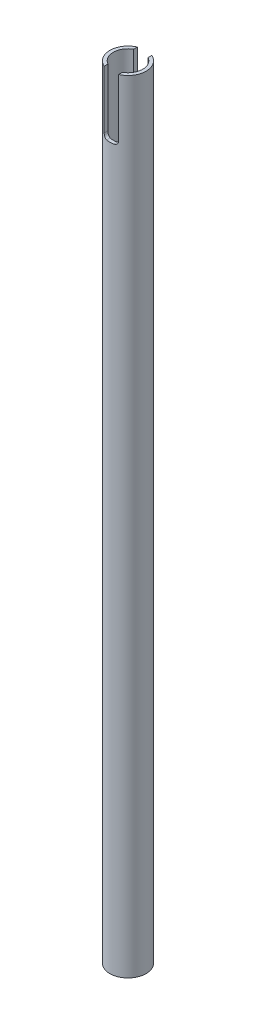
ISO-10303-21;
HEADER;
FILE_DESCRIPTION(('STEP AP214'),'2;1');
FILE_NAME('part.step','',(''),(''),'','','');
FILE_SCHEMA(('AUTOMOTIVE_DESIGN { 1 0 10303 214 1 1 1 1 }'));
ENDSEC;
DATA;
#1=APPLICATION_CONTEXT('core data for automotive mechanical design processes');
#2=APPLICATION_PROTOCOL_DEFINITION('international standard','automotive_design',2000,#1);
#3=PRODUCT_CONTEXT('',#1,'mechanical');
#4=PRODUCT('Part','Part','',(#3));
#5=PRODUCT_RELATED_PRODUCT_CATEGORY('part','',(#4));
#6=PRODUCT_DEFINITION_FORMATION('','',#4);
#7=PRODUCT_DEFINITION_CONTEXT('part definition',#1,'design');
#8=PRODUCT_DEFINITION('design','',#6,#7);
#9=PRODUCT_DEFINITION_SHAPE('','',#8);
#10=(LENGTH_UNIT() NAMED_UNIT(*) SI_UNIT(.MILLI.,.METRE.));
#11=(NAMED_UNIT(*) PLANE_ANGLE_UNIT() SI_UNIT($,.RADIAN.));
#12=(NAMED_UNIT(*) SI_UNIT($,.STERADIAN.) SOLID_ANGLE_UNIT());
#13=UNCERTAINTY_MEASURE_WITH_UNIT(LENGTH_MEASURE(1.E-05),#10,'distance_accuracy_value','');
#14=(GEOMETRIC_REPRESENTATION_CONTEXT(3) GLOBAL_UNCERTAINTY_ASSIGNED_CONTEXT((#13)) GLOBAL_UNIT_ASSIGNED_CONTEXT((#10,
#11,#12)) REPRESENTATION_CONTEXT('',''));
#15=CARTESIAN_POINT('',(0.,0.,0.));
#16=DIRECTION('',(0.,0.,1.));
#17=DIRECTION('',(1.,0.,0.));
#18=AXIS2_PLACEMENT_3D('',#15,#16,#17);
#19=CARTESIAN_POINT('',(-3.17500000000001,178.384457539078,0.));
#20=DIRECTION('',(0.,1.,0.));
#21=DIRECTION('',(0.,0.,-1.));
#22=AXIS2_PLACEMENT_3D('',#19,#20,#21);
#23=PLANE('',#22);
#24=DIRECTION('',(0.,0.,1.));
#25=VECTOR('',#24,1.);
#26=CARTESIAN_POINT('',(-3.17500000000001,178.384457539078,0.));
#27=LINE('',#26,#25);
#28=CARTESIAN_POINT('',(-3.17500000000001,178.384457539078,-7.27483891574239));
#29=VERTEX_POINT('',#28);
#30=CARTESIAN_POINT('',(-3.17500000000001,178.384457539078,-5.63085690548072));
#31=VERTEX_POINT('',#30);
#32=EDGE_CURVE('E183',#29,#31,#27,.T.);
#33=ORIENTED_EDGE('',*,*,#32,.F.);
#34=CARTESIAN_POINT('',(0.,178.384457539078,0.));
#35=DIRECTION('',(0.,1.,0.));
#36=DIRECTION('',(0.,0.,1.));
#37=AXIS2_PLACEMENT_3D('',#34,#35,#36);
#38=CIRCLE('',#37,7.9375);
#39=CARTESIAN_POINT('',(-3.17500000000001,178.384457539078,7.27483891574239));
#40=VERTEX_POINT('',#39);
#41=EDGE_CURVE('E155',#29,#40,#38,.T.);
#42=ORIENTED_EDGE('',*,*,#41,.T.);
#43=CARTESIAN_POINT('',(-3.17500000000001,178.384457539078,5.63085690548072));
#44=VERTEX_POINT('',#43);
#45=EDGE_CURVE('E180',#44,#40,#27,.T.);
#46=ORIENTED_EDGE('',*,*,#45,.F.);
#47=CARTESIAN_POINT('',(0.,178.384457539078,0.));
#48=DIRECTION('',(0.,1.,0.));
#49=DIRECTION('',(0.,0.,1.));
#50=AXIS2_PLACEMENT_3D('',#47,#48,#49);
#51=CIRCLE('',#50,6.4643);
#52=EDGE_CURVE('E178',#31,#44,#51,.T.);
#53=ORIENTED_EDGE('',*,*,#52,.F.);
#54=EDGE_LOOP('',(#33,#42,#46,#53));
#55=FACE_BOUND('',#54,.T.);
#56=ADVANCED_FACE('F37',(#55),#23,.T.);
#57=CARTESIAN_POINT('',(0.,226.235097841751,0.));
#58=DIRECTION('',(0.,-1.,0.));
#59=DIRECTION('',(0.,0.,-1.));
#60=AXIS2_PLACEMENT_3D('',#57,#58,#59);
#61=CYLINDRICAL_SURFACE('',#60,7.9375);
#62=CARTESIAN_POINT('',(0.,-164.670652333005,0.));
#63=DIRECTION('',(0.,1.,0.));
#64=DIRECTION('',(0.,0.,1.));
#65=AXIS2_PLACEMENT_3D('',#62,#63,#64);
#66=CIRCLE('',#65,7.9375);
#67=CARTESIAN_POINT('',(0.,-164.670652333005,7.9375));
#68=VERTEX_POINT('',#67);
#69=EDGE_CURVE('E160',#68,#68,#66,.T.);
#70=ORIENTED_EDGE('',*,*,#69,.T.);
#71=EDGE_LOOP('',(#70));
#72=FACE_BOUND('',#71,.T.);
#73=CARTESIAN_POINT('',(1.58750000000002,151.396957539078,-7.77712993333659));
#74=CARTESIAN_POINT('',(1.63350676862774,151.396957782668,-7.76774126330065));
#75=CARTESIAN_POINT('',(1.67940359564178,151.398958443785,-7.75794444810861));
#76=CARTESIAN_POINT('',(1.77068039580913,151.406895807103,-7.73762089991974));
#77=CARTESIAN_POINT('',(1.81606050148706,151.412831475852,-7.72709435922087));
#78=CARTESIAN_POINT('',(1.95078228156834,151.436404425103,-7.69459845201109));
#79=CARTESIAN_POINT('',(2.03894812030824,151.459808372025,-7.67166299368629));
#80=CARTESIAN_POINT('',(2.20953807004378,151.521088569197,-7.62428385726793));
#81=CARTESIAN_POINT('',(2.29196515383517,151.558957259457,-7.59984097261637));
#82=CARTESIAN_POINT('',(2.44917385980107,151.648104529498,-7.55064502184106));
#83=CARTESIAN_POINT('',(2.52395227814501,151.699388696943,-7.52589183057164));
#84=CARTESIAN_POINT('',(2.66543932718696,151.815375744899,-7.47696931777061));
#85=CARTESIAN_POINT('',(2.73193883493115,151.880344470014,-7.45282414598359));
#86=CARTESIAN_POINT('',(2.85299322074863,152.021482683847,-7.40732925012121));
#87=CARTESIAN_POINT('',(2.90754767783195,152.097652567179,-7.38597962458242));
#88=CARTESIAN_POINT('',(3.00159155783957,152.257226267662,-7.34825600672414));
#89=CARTESIAN_POINT('',(3.04142452291154,152.340400722923,-7.33177064627854));
#90=CARTESIAN_POINT('',(3.10622330269328,152.513171355023,-7.30455577634142));
#91=CARTESIAN_POINT('',(3.13121458917046,152.602756232192,-7.29381640854949));
#92=CARTESIAN_POINT('',(3.15710194076301,152.74180405196,-7.28263004031741));
#93=CARTESIAN_POINT('',(3.1638049583103,152.7900592788,-7.27971714426163));
#94=CARTESIAN_POINT('',(3.17275416759986,152.88701869723,-7.27581937849739));
#95=CARTESIAN_POINT('',(3.17500392571318,152.935722498147,-7.27483296598246));
#96=CARTESIAN_POINT('',(3.17500000000002,152.984457539078,-7.27483891574239));
#97=B_SPLINE_CURVE_WITH_KNOTS('',3,(#73,#74,#75,#76,#77,#78,#79,#80,#81,#82,#83,#84,#85,#86,#87,
#88,#89,#90,#91,#92,#93,#94,#95,#96),.UNSPECIFIED.,.F.,.F.,(4,2,2,2,2,2,2,2,2,2,2,4),(0.,
0.140770845296605,0.281504734514007,0.562238948643036,0.842826637517782,1.12353138019525,
1.41029752992663,1.69707378478449,1.97665708187308,2.25575915194298,2.40195937855943,
2.54804247399296),.UNSPECIFIED.);
#98=CARTESIAN_POINT('',(1.58750000000002,151.396957539078,-7.77712993333659));
#99=VERTEX_POINT('',#98);
#100=CARTESIAN_POINT('',(3.17500000000002,152.984457539078,-7.27483891574239));
#101=VERTEX_POINT('',#100);
#102=EDGE_CURVE('E149',#99,#101,#97,.T.);
#103=ORIENTED_EDGE('',*,*,#102,.T.);
#104=DIRECTION('',(0.,-1.,0.));
#105=VECTOR('',#104,1.);
#106=CARTESIAN_POINT('',(3.175,226.235097841751,-7.2748389157424));
#107=LINE('',#106,#105);
#108=CARTESIAN_POINT('',(3.17500000000001,178.384457539078,-7.27483891574239));
#109=VERTEX_POINT('',#108);
#110=EDGE_CURVE('E135',#101,#109,#107,.F.);
#111=ORIENTED_EDGE('',*,*,#110,.T.);
#112=CARTESIAN_POINT('',(3.17500000000002,178.384457539078,7.27483891574239));
#113=VERTEX_POINT('',#112);
#114=EDGE_CURVE('E143',#113,#109,#38,.T.);
#115=ORIENTED_EDGE('',*,*,#114,.F.);
#116=DIRECTION('',(0.,-1.,0.));
#117=VECTOR('',#116,1.);
#118=CARTESIAN_POINT('',(3.175,226.235097841751,7.2748389157424));
#119=LINE('',#118,#117);
#120=CARTESIAN_POINT('',(3.17500000000002,152.984457539078,7.27483891574239));
#121=VERTEX_POINT('',#120);
#122=EDGE_CURVE('E60',#113,#121,#119,.T.);
#123=ORIENTED_EDGE('',*,*,#122,.T.);
#124=CARTESIAN_POINT('',(3.17500000000002,152.984457539078,7.27483891574239));
#125=CARTESIAN_POINT('',(3.1750016811366,152.942085987096,7.27483586366097));
#126=CARTESIAN_POINT('',(3.1733024516557,152.899736291432,7.27558001702575));
#127=CARTESIAN_POINT('',(3.1665366187788,152.815370476962,7.27852818539399));
#128=CARTESIAN_POINT('',(3.1614710291776,152.773354261581,7.2807317608851));
#129=CARTESIAN_POINT('',(3.14133450163411,152.648571903566,7.289454657789));
#130=CARTESIAN_POINT('',(3.12132308750016,152.566691584476,7.29808678684576));
#131=CARTESIAN_POINT('',(3.06894040253674,152.407833696476,7.32026684625098));
#132=CARTESIAN_POINT('',(3.0365778308593,152.330852721289,7.33381131641249));
#133=CARTESIAN_POINT('',(2.96061234627718,152.183460140913,7.36480545430104));
#134=CARTESIAN_POINT('',(2.91700139314282,152.113053284072,7.38225791423851));
#135=CARTESIAN_POINT('',(2.81767453343919,151.977378995204,7.42075264717214));
#136=CARTESIAN_POINT('',(2.76150754869705,151.912477985441,7.44191980144857));
#137=CARTESIAN_POINT('',(2.63982081610508,151.792792461736,7.48594933347425));
#138=CARTESIAN_POINT('',(2.57429738653626,151.73801194972,7.50881237683832));
#139=CARTESIAN_POINT('',(2.43069507728357,151.636334562647,7.55656843444928));
#140=CARTESIAN_POINT('',(2.35206470826208,151.590230033672,7.58149355937878));
#141=CARTESIAN_POINT('',(2.18789362747882,151.512064429473,7.63048866953835));
#142=CARTESIAN_POINT('',(2.10235659094265,151.479995942866,7.65455909988381));
#143=CARTESIAN_POINT('',(1.94541809174973,151.436170948093,7.69573507431978));
#144=CARTESIAN_POINT('',(1.8749103784245,151.421535843247,7.71322855066071));
#145=CARTESIAN_POINT('',(1.73219113401291,151.401920081394,7.74654000063456));
#146=CARTESIAN_POINT('',(1.65997981118746,151.39693825043,7.76235817778308));
#147=CARTESIAN_POINT('',(1.58750000000002,151.396957539078,7.77712993333659));
#148=B_SPLINE_CURVE_WITH_KNOTS('',3,(#124,#125,#126,#127,#128,#129,#130,#131,#132,#133,#134,
#135,#136,#137,#138,#139,#140,#141,#142,#143,#144,#145,#146,#147),.UNSPECIFIED.,.F.,.F.,(4,2,2,
2,2,2,2,2,2,2,2,4),(0.,0.127031494291915,0.254024749792407,0.506885265042619,0.759568013575071,
1.01243188015942,1.27651034681323,1.54069301498292,1.82289095795798,2.10493971303588,
2.32661111398098,2.54825555529032),.UNSPECIFIED.);
#149=CARTESIAN_POINT('',(1.58750000000002,151.396957539078,7.77712993333659));
#150=VERTEX_POINT('',#149);
#151=EDGE_CURVE('E163',#121,#150,#148,.T.);
#152=ORIENTED_EDGE('',*,*,#151,.T.);
#153=CARTESIAN_POINT('',(0.,151.396957539078,0.));
#154=DIRECTION('',(0.,-1.,0.));
#155=DIRECTION('',(0.,0.,-1.));
#156=AXIS2_PLACEMENT_3D('',#153,#154,#155);
#157=CIRCLE('',#156,7.9375);
#158=CARTESIAN_POINT('',(-1.58750000000001,151.396957539078,7.77712993333659));
#159=VERTEX_POINT('',#158);
#160=EDGE_CURVE('E237',#150,#159,#157,.T.);
#161=ORIENTED_EDGE('',*,*,#160,.T.);
#162=CARTESIAN_POINT('',(-1.58750000000001,151.396957539078,7.77712993333659));
#163=CARTESIAN_POINT('',(-1.63350676862774,151.396957782668,7.76774126330065));
#164=CARTESIAN_POINT('',(-1.67940359564177,151.398958443785,7.75794444810861));
#165=CARTESIAN_POINT('',(-1.77068039580912,151.406895807103,7.73762089991974));
#166=CARTESIAN_POINT('',(-1.81606050148705,151.412831475852,7.72709435922087));
#167=CARTESIAN_POINT('',(-1.95078228156834,151.436404425103,7.6945984520111));
#168=CARTESIAN_POINT('',(-2.03894812030823,151.459808372025,7.67166299368629));
#169=CARTESIAN_POINT('',(-2.20953807004377,151.521088569197,7.62428385726793));
#170=CARTESIAN_POINT('',(-2.29196515383517,151.558957259457,7.59984097261638));
#171=CARTESIAN_POINT('',(-2.44917385980107,151.648104529498,7.55064502184106));
#172=CARTESIAN_POINT('',(-2.52395227814501,151.699388696943,7.52589183057164));
#173=CARTESIAN_POINT('',(-2.66543932718695,151.815375744899,7.47696931777061));
#174=CARTESIAN_POINT('',(-2.73193883493114,151.880344470014,7.45282414598359));
#175=CARTESIAN_POINT('',(-2.85299322074862,152.021482683847,7.40732925012121));
#176=CARTESIAN_POINT('',(-2.90754767783194,152.097652567179,7.38597962458242));
#177=CARTESIAN_POINT('',(-3.00159155783956,152.257226267662,7.34825600672414));
#178=CARTESIAN_POINT('',(-3.04142452291152,152.340400722923,7.33177064627854));
#179=CARTESIAN_POINT('',(-3.10622330269327,152.513171355023,7.30455577634143));
#180=CARTESIAN_POINT('',(-3.13121458917045,152.602756232192,7.29381640854949));
#181=CARTESIAN_POINT('',(-3.15710194076301,152.74180405196,7.28263004031741));
#182=CARTESIAN_POINT('',(-3.16380495831029,152.7900592788,7.27971714426164));
#183=CARTESIAN_POINT('',(-3.17275416759985,152.88701869723,7.2758193784974));
#184=CARTESIAN_POINT('',(-3.17500392571317,152.935722498147,7.27483296598247));
#185=CARTESIAN_POINT('',(-3.17500000000001,152.984457539078,7.27483891574239));
#186=B_SPLINE_CURVE_WITH_KNOTS('',3,(#162,#163,#164,#165,#166,#167,#168,#169,#170,#171,#172,
#173,#174,#175,#176,#177,#178,#179,#180,#181,#182,#183,#184,#185),.UNSPECIFIED.,.F.,.F.,(4,2,2,
2,2,2,2,2,2,2,2,4),(0.,0.140770845296605,0.281504734514008,0.562238948643036,0.842826637517783,
1.12353138019525,1.41029752992663,1.69707378478449,1.97665708187305,2.255759151943,
2.4019593785594,2.54804247399296),.UNSPECIFIED.);
#187=CARTESIAN_POINT('',(-3.17500000000001,152.984457539078,7.27483891574239));
#188=VERTEX_POINT('',#187);
#189=EDGE_CURVE('E225',#159,#188,#186,.T.);
#190=ORIENTED_EDGE('',*,*,#189,.T.);
#191=DIRECTION('',(0.,-1.,0.));
#192=VECTOR('',#191,1.);
#193=CARTESIAN_POINT('',(-3.17500000000001,226.235097841751,7.27483891574239));
#194=LINE('',#193,#192);
#195=EDGE_CURVE('E304',#188,#40,#194,.F.);
#196=ORIENTED_EDGE('',*,*,#195,.T.);
#197=ORIENTED_EDGE('',*,*,#41,.F.);
#198=DIRECTION('',(0.,-1.,0.));
#199=VECTOR('',#198,1.);
#200=CARTESIAN_POINT('',(-3.17500000000001,226.235097841751,-7.27483891574239));
#201=LINE('',#200,#199);
#202=CARTESIAN_POINT('',(-3.17500000000001,152.984457539078,-7.27483891574239));
#203=VERTEX_POINT('',#202);
#204=EDGE_CURVE('E226',#29,#203,#201,.T.);
#205=ORIENTED_EDGE('',*,*,#204,.T.);
#206=CARTESIAN_POINT('',(-3.17500000000001,152.984457539078,-7.27483891574239));
#207=CARTESIAN_POINT('',(-3.17500168113659,152.942085987096,-7.27483586366097));
#208=CARTESIAN_POINT('',(-3.17330245165569,152.899736291432,-7.27558001702575));
#209=CARTESIAN_POINT('',(-3.1665366187788,152.815370476962,-7.27852818539399));
#210=CARTESIAN_POINT('',(-3.1614710291776,152.773354261581,-7.28073176088511));
#211=CARTESIAN_POINT('',(-3.1413345016341,152.648571903566,-7.28945465778901));
#212=CARTESIAN_POINT('',(-3.12132308750016,152.566691584476,-7.29808678684576));
#213=CARTESIAN_POINT('',(-3.06894040253673,152.407833696476,-7.32026684625098));
#214=CARTESIAN_POINT('',(-3.03657783085929,152.330852721289,-7.3338113164125));
#215=CARTESIAN_POINT('',(-2.96061234627717,152.183460140913,-7.36480545430105));
#216=CARTESIAN_POINT('',(-2.91700139314282,152.113053284072,-7.38225791423851));
#217=CARTESIAN_POINT('',(-2.81767453343918,151.977378995204,-7.42075264717215));
#218=CARTESIAN_POINT('',(-2.76150754869704,151.912477985441,-7.44191980144857));
#219=CARTESIAN_POINT('',(-2.63982081610508,151.792792461736,-7.48594933347425));
#220=CARTESIAN_POINT('',(-2.57429738653625,151.73801194972,-7.50881237683833));
#221=CARTESIAN_POINT('',(-2.43069507728356,151.636334562647,-7.55656843444928));
#222=CARTESIAN_POINT('',(-2.35206470826208,151.590230033672,-7.58149355937877));
#223=CARTESIAN_POINT('',(-2.18789362747882,151.512064429473,-7.63048866953835));
#224=CARTESIAN_POINT('',(-2.10235659094264,151.479995942866,-7.65455909988381));
#225=CARTESIAN_POINT('',(-1.94541809174973,151.436170948093,-7.69573507431979));
#226=CARTESIAN_POINT('',(-1.8749103784245,151.421535843247,-7.71322855066071));
#227=CARTESIAN_POINT('',(-1.73219113401291,151.401920081394,-7.74654000063456));
#228=CARTESIAN_POINT('',(-1.65997981118746,151.39693825043,-7.76235817778308));
#229=CARTESIAN_POINT('',(-1.58750000000001,151.396957539078,-7.77712993333659));
#230=B_SPLINE_CURVE_WITH_KNOTS('',3,(#206,#207,#208,#209,#210,#211,#212,#213,#214,#215,#216,
#217,#218,#219,#220,#221,#222,#223,#224,#225,#226,#227,#228,#229),.UNSPECIFIED.,.F.,.F.,(4,2,2,
2,2,2,2,2,2,2,2,4),(0.,0.127031494291915,0.254024749792407,0.506885265042619,0.759568013575071,
1.01243188015942,1.27651034681323,1.54069301498292,1.82289095795797,2.10493971303587,
2.32661111398097,2.54825555529031),.UNSPECIFIED.);
#231=CARTESIAN_POINT('',(-1.58750000000001,151.396957539078,-7.77712993333659));
#232=VERTEX_POINT('',#231);
#233=EDGE_CURVE('E217',#203,#232,#230,.T.);
#234=ORIENTED_EDGE('',*,*,#233,.T.);
#235=EDGE_CURVE('E235',#232,#99,#157,.T.);
#236=ORIENTED_EDGE('',*,*,#235,.T.);
#237=EDGE_LOOP('',(#103,#111,#115,#123,#152,#161,#190,#196,#197,#205,#234,#236));
#238=FACE_BOUND('',#237,.T.);
#239=ADVANCED_FACE('F39',(#72,#238),#61,.T.);
#240=CARTESIAN_POINT('',(0.,-164.670652333005,0.));
#241=DIRECTION('',(0.,1.,0.));
#242=DIRECTION('',(0.,0.,1.));
#243=AXIS2_PLACEMENT_3D('',#240,#241,#242);
#244=PLANE('',#243);
#245=ORIENTED_EDGE('',*,*,#69,.F.);
#246=EDGE_LOOP('',(#245));
#247=FACE_BOUND('',#246,.T.);
#248=CARTESIAN_POINT('',(0.,-164.670652333005,0.));
#249=DIRECTION('',(0.,1.,0.));
#250=DIRECTION('',(0.,0.,1.));
#251=AXIS2_PLACEMENT_3D('',#248,#249,#250);
#252=CIRCLE('',#251,6.4643);
#253=CARTESIAN_POINT('',(0.,-164.670652333005,6.4643));
#254=VERTEX_POINT('',#253);
#255=EDGE_CURVE('E169',#254,#254,#252,.T.);
#256=ORIENTED_EDGE('',*,*,#255,.T.);
#257=EDGE_LOOP('',(#256));
#258=FACE_BOUND('',#257,.T.);
#259=ADVANCED_FACE('F368',(#247,#258),#244,.F.);
#260=CARTESIAN_POINT('',(0.,226.235097841751,0.));
#261=DIRECTION('',(0.,-1.,0.));
#262=DIRECTION('',(0.,0.,-1.));
#263=AXIS2_PLACEMENT_3D('',#260,#261,#262);
#264=CYLINDRICAL_SURFACE('',#263,6.4643);
#265=DIRECTION('',(0.,-1.,0.));
#266=VECTOR('',#265,1.);
#267=CARTESIAN_POINT('',(-3.17500000000001,226.235097841751,5.63085690548072));
#268=LINE('',#267,#266);
#269=CARTESIAN_POINT('',(-3.17500000000001,152.984457539078,5.63085690548072));
#270=VERTEX_POINT('',#269);
#271=EDGE_CURVE('E293',#270,#44,#268,.F.);
#272=ORIENTED_EDGE('',*,*,#271,.F.);
#273=CARTESIAN_POINT('',(-1.58750000000001,151.396957539078,6.26634009929241));
#274=CARTESIAN_POINT('',(-1.6341890068028,151.396957760493,6.25451519937794));
#275=CARTESIAN_POINT('',(-1.68071621150092,151.399018053033,6.2421690242475));
#276=CARTESIAN_POINT('',(-1.77313930969814,151.407166464718,6.21654599792506));
#277=CARTESIAN_POINT('',(-1.81903543834438,151.413253039684,6.20326950527711));
#278=CARTESIAN_POINT('',(-1.95507469082073,151.437363963433,6.16228683989147));
#279=CARTESIAN_POINT('',(-2.04387534201678,151.461240782371,6.13334935224697));
#280=CARTESIAN_POINT('',(-2.21532061503982,151.523525488718,6.07353181019977));
#281=CARTESIAN_POINT('',(-2.29797173444355,151.561917770499,6.04265387160463));
#282=CARTESIAN_POINT('',(-2.45546303738964,151.652152724394,5.98038883139863));
#283=CARTESIAN_POINT('',(-2.53029702370296,151.704005956215,5.94900134826912));
#284=CARTESIAN_POINT('',(-2.67287075398234,151.822129673087,5.88635884745834));
#285=CARTESIAN_POINT('',(-2.74025626996523,151.888853558726,5.85514963173659));
#286=CARTESIAN_POINT('',(-2.86271368076049,152.034190820098,5.79626340236597));
#287=CARTESIAN_POINT('',(-2.91778558227085,152.112804189363,5.76858638679577));
#288=CARTESIAN_POINT('',(-3.01168872656628,152.277026123609,5.72010524984433));
#289=CARTESIAN_POINT('',(-3.05104502216774,152.362268726949,5.6990849029132));
#290=CARTESIAN_POINT('',(-3.11430373465245,152.539669521428,5.66476886814871));
#291=CARTESIAN_POINT('',(-3.13824572360376,152.631809320771,5.6514534090763));
#292=CARTESIAN_POINT('',(-3.16081362599347,152.768302328646,5.63883740321026));
#293=CARTESIAN_POINT('',(-3.16612512648616,152.811311075712,5.63585394797714));
#294=CARTESIAN_POINT('',(-3.17321828948631,152.897689116316,5.63186201493137));
#295=CARTESIAN_POINT('',(-3.1750015725431,152.941058235135,5.63085263040864));
#296=CARTESIAN_POINT('',(-3.17500000000001,152.984457539078,5.63085690548072));
#297=B_SPLINE_CURVE_WITH_KNOTS('',3,(#273,#274,#275,#276,#277,#278,#279,#280,#281,#282,#283,
#284,#285,#286,#287,#288,#289,#290,#291,#292,#293,#294,#295,#296),.UNSPECIFIED.,.F.,.F.,(4,2,2,
2,2,2,2,2,2,2,2,4),(0.,0.1443887409403,0.288722137366155,0.576452128922374,0.86387365648989,
1.15152134248762,1.44956694911563,1.74761239362141,2.03464137858751,2.32093052452343,
2.45108160789033,2.58117289753274),.UNSPECIFIED.);
#298=CARTESIAN_POINT('',(-1.58750000000001,151.396957539078,6.26634009929241));
#299=VERTEX_POINT('',#298);
#300=EDGE_CURVE('E211',#299,#270,#297,.T.);
#301=ORIENTED_EDGE('',*,*,#300,.F.);
#302=CARTESIAN_POINT('',(0.,151.396957539078,0.));
#303=DIRECTION('',(0.,-1.,0.));
#304=DIRECTION('',(0.,0.,-1.));
#305=AXIS2_PLACEMENT_3D('',#302,#303,#304);
#306=CIRCLE('',#305,6.4643);
#307=CARTESIAN_POINT('',(1.58750000000002,151.396957539078,6.2663400992924));
#308=VERTEX_POINT('',#307);
#309=EDGE_CURVE('E53',#308,#299,#306,.T.);
#310=ORIENTED_EDGE('',*,*,#309,.F.);
#311=CARTESIAN_POINT('',(3.17500000000002,152.984457539078,5.63085690548072));
#312=CARTESIAN_POINT('',(3.17500265942432,152.943300708403,5.63085243150938));
#313=CARTESIAN_POINT('',(3.17339835018607,152.902166186228,5.63176028239596));
#314=CARTESIAN_POINT('',(3.16701766507688,152.820240370888,5.63535215701949));
#315=CARTESIAN_POINT('',(3.16224273305132,152.779448930047,5.63803537228503));
#316=CARTESIAN_POINT('',(3.14329664507896,152.658453703273,5.64863522411122));
#317=CARTESIAN_POINT('',(3.12450305374457,152.579141650832,5.65910325483871));
#318=CARTESIAN_POINT('',(3.07549165040551,152.425391756334,5.68588522764516));
#319=CARTESIAN_POINT('',(3.04528974537462,152.350947296014,5.70219102829139));
#320=CARTESIAN_POINT('',(2.97460119282058,152.208279675018,5.73938277272117));
#321=CARTESIAN_POINT('',(2.93410271969423,152.140063791127,5.76027397904372));
#322=CARTESIAN_POINT('',(2.84103773378424,152.006785822867,5.80676804025645));
#323=CARTESIAN_POINT('',(2.78784532739575,151.942239660805,5.8325925450642));
#324=CARTESIAN_POINT('',(2.67254263369963,151.822672950767,5.88631786935967));
#325=CARTESIAN_POINT('',(2.61042818908354,151.767656869933,5.91421965383982));
#326=CARTESIAN_POINT('',(2.47143371409537,151.662640021626,5.97373371686978));
#327=CARTESIAN_POINT('',(2.39368295701584,151.61382960207,6.00542032126395));
#328=CARTESIAN_POINT('',(2.23068225215683,151.53020220402,6.06785364975218));
#329=CARTESIAN_POINT('',(2.14543609512394,151.495378201047,6.09860083846705));
#330=CARTESIAN_POINT('',(1.98216120584026,151.444780927415,6.15341243852267));
#331=CARTESIAN_POINT('',(1.90486553835029,151.426984016479,6.17780100436401));
#332=CARTESIAN_POINT('',(1.74771289593291,151.40305484867,6.22410888754503));
#333=CARTESIAN_POINT('',(1.66785396509174,151.396931725586,6.24602625877211));
#334=CARTESIAN_POINT('',(1.58750000000002,151.396957539078,6.2663400992924));
#335=B_SPLINE_CURVE_WITH_KNOTS('',3,(#311,#312,#313,#314,#315,#316,#317,#318,#319,#320,#321,
#322,#323,#324,#325,#326,#327,#328,#329,#330,#331,#332,#333,#334),.UNSPECIFIED.,.F.,.F.,(4,2,2,
2,2,2,2,2,2,2,2,4),(0.,0.123386261727179,0.246716374037833,0.491934980105682,0.736812924701854,
0.981973392060152,1.24352761602776,1.50520411142376,1.79524970866349,2.08514945193372,
2.33322496948236,2.58149450643057),.UNSPECIFIED.);
#336=CARTESIAN_POINT('',(3.17500000000002,152.984457539078,5.63085690548072));
#337=VERTEX_POINT('',#336);
#338=EDGE_CURVE('E12',#337,#308,#335,.T.);
#339=ORIENTED_EDGE('',*,*,#338,.F.);
#340=DIRECTION('',(0.,-1.,0.));
#341=VECTOR('',#340,1.);
#342=CARTESIAN_POINT('',(3.175,226.235097841751,5.63085690548073));
#343=LINE('',#342,#341);
#344=CARTESIAN_POINT('',(3.17500000000001,178.384457539078,5.63085690548072));
#345=VERTEX_POINT('',#344);
#346=EDGE_CURVE('E151',#345,#337,#343,.T.);
#347=ORIENTED_EDGE('',*,*,#346,.F.);
#348=CARTESIAN_POINT('',(3.17500000000002,178.384457539078,-5.63085690548072));
#349=VERTEX_POINT('',#348);
#350=EDGE_CURVE('E173',#345,#349,#51,.T.);
#351=ORIENTED_EDGE('',*,*,#350,.T.);
#352=DIRECTION('',(0.,-1.,0.));
#353=VECTOR('',#352,1.);
#354=CARTESIAN_POINT('',(3.175,226.235097841751,-5.63085690548073));
#355=LINE('',#354,#353);
#356=CARTESIAN_POINT('',(3.17500000000002,152.984457539078,-5.63085690548072));
#357=VERTEX_POINT('',#356);
#358=EDGE_CURVE('E68',#357,#349,#355,.F.);
#359=ORIENTED_EDGE('',*,*,#358,.F.);
#360=CARTESIAN_POINT('',(1.58750000000002,151.396957539078,-6.2663400992924));
#361=CARTESIAN_POINT('',(1.6341890068028,151.396957760493,-6.25451519937793));
#362=CARTESIAN_POINT('',(1.68071621150093,151.399018053033,-6.24216902424749));
#363=CARTESIAN_POINT('',(1.77313930969815,151.407166464718,-6.21654599792506));
#364=CARTESIAN_POINT('',(1.81903543834439,151.413253039684,-6.20326950527711));
#365=CARTESIAN_POINT('',(1.95507469082074,151.437363963433,-6.16228683989147));
#366=CARTESIAN_POINT('',(2.04387534201679,151.461240782371,-6.13334935224697));
#367=CARTESIAN_POINT('',(2.21532061503984,151.523525488718,-6.07353181019977));
#368=CARTESIAN_POINT('',(2.29797173444357,151.5619177705,-6.04265387160462));
#369=CARTESIAN_POINT('',(2.45546303738966,151.652152724394,-5.98038883139862));
#370=CARTESIAN_POINT('',(2.53029702370297,151.704005956215,-5.94900134826911));
#371=CARTESIAN_POINT('',(2.67287075398235,151.822129673087,-5.88635884745834));
#372=CARTESIAN_POINT('',(2.74025626996524,151.888853558726,-5.85514963173659));
#373=CARTESIAN_POINT('',(2.8627136807605,152.034190820098,-5.79626340236597));
#374=CARTESIAN_POINT('',(2.91778558227085,152.112804189363,-5.76858638679577));
#375=CARTESIAN_POINT('',(3.0116887265663,152.277026123609,-5.72010524984432));
#376=CARTESIAN_POINT('',(3.05104502216776,152.362268726949,-5.69908490291319));
#377=CARTESIAN_POINT('',(3.11430373465247,152.539669521428,-5.6647688681487));
#378=CARTESIAN_POINT('',(3.13824572360378,152.631809320771,-5.65145340907629));
#379=CARTESIAN_POINT('',(3.16081362599348,152.768302328646,-5.63883740321026));
#380=CARTESIAN_POINT('',(3.16612512648617,152.811311075712,-5.63585394797713));
#381=CARTESIAN_POINT('',(3.17321828948632,152.897689116316,-5.63186201493136));
#382=CARTESIAN_POINT('',(3.17500157254311,152.941058235135,-5.63085263040864));
#383=CARTESIAN_POINT('',(3.17500000000002,152.984457539078,-5.63085690548072));
#384=B_SPLINE_CURVE_WITH_KNOTS('',3,(#360,#361,#362,#363,#364,#365,#366,#367,#368,#369,#370,
#371,#372,#373,#374,#375,#376,#377,#378,#379,#380,#381,#382,#383),.UNSPECIFIED.,.F.,.F.,(4,2,2,
2,2,2,2,2,2,2,2,4),(0.,0.144388740940299,0.288722137366156,0.576452128922375,0.863873656489913,
1.15152134248761,1.44956694911562,1.7476123936214,2.03464137858756,2.32093052452346,
2.45108160789038,2.58117289753274),.UNSPECIFIED.);
#385=CARTESIAN_POINT('',(1.58750000000002,151.396957539078,-6.2663400992924));
#386=VERTEX_POINT('',#385);
#387=EDGE_CURVE('E252',#386,#357,#384,.T.);
#388=ORIENTED_EDGE('',*,*,#387,.F.);
#389=CARTESIAN_POINT('',(-1.58750000000001,151.396957539078,-6.26634009929241));
#390=VERTEX_POINT('',#389);
#391=EDGE_CURVE('E192',#390,#386,#306,.T.);
#392=ORIENTED_EDGE('',*,*,#391,.F.);
#393=CARTESIAN_POINT('',(-3.17500000000001,152.984457539078,-5.63085690548072));
#394=CARTESIAN_POINT('',(-3.17500265942432,152.943300708403,-5.63085243150939));
#395=CARTESIAN_POINT('',(-3.17339835018607,152.902166186228,-5.63176028239596));
#396=CARTESIAN_POINT('',(-3.16701766507688,152.820240370888,-5.6353521570195));
#397=CARTESIAN_POINT('',(-3.16224273305131,152.779448930047,-5.63803537228504));
#398=CARTESIAN_POINT('',(-3.14329664507895,152.658453703273,-5.64863522411122));
#399=CARTESIAN_POINT('',(-3.12450305374456,152.579141650832,-5.65910325483872));
#400=CARTESIAN_POINT('',(-3.07549165040551,152.425391756334,-5.68588522764517));
#401=CARTESIAN_POINT('',(-3.04528974537461,152.350947296014,-5.7021910282914));
#402=CARTESIAN_POINT('',(-2.97460119282057,152.208279675018,-5.73938277272117));
#403=CARTESIAN_POINT('',(-2.93410271969422,152.140063791127,-5.76027397904372));
#404=CARTESIAN_POINT('',(-2.84103773378423,152.006785822867,-5.80676804025646));
#405=CARTESIAN_POINT('',(-2.78784532739574,151.942239660805,-5.83259254506421));
#406=CARTESIAN_POINT('',(-2.67254263369962,151.822672950767,-5.88631786935967));
#407=CARTESIAN_POINT('',(-2.61042818908353,151.767656869933,-5.91421965383982));
#408=CARTESIAN_POINT('',(-2.47143371409537,151.662640021626,-5.97373371686978));
#409=CARTESIAN_POINT('',(-2.39368295701583,151.61382960207,-6.00542032126396));
#410=CARTESIAN_POINT('',(-2.23068225215683,151.53020220402,-6.06785364975219));
#411=CARTESIAN_POINT('',(-2.14543609512394,151.495378201047,-6.09860083846705));
#412=CARTESIAN_POINT('',(-1.98216120584026,151.444780927415,-6.15341243852267));
#413=CARTESIAN_POINT('',(-1.90486553835028,151.426984016479,-6.17780100436402));
#414=CARTESIAN_POINT('',(-1.7477128959329,151.40305484867,-6.22410888754503));
#415=CARTESIAN_POINT('',(-1.66785396509173,151.396931725586,-6.24602625877211));
#416=CARTESIAN_POINT('',(-1.58750000000001,151.396957539078,-6.26634009929241));
#417=B_SPLINE_CURVE_WITH_KNOTS('',3,(#393,#394,#395,#396,#397,#398,#399,#400,#401,#402,#403,
#404,#405,#406,#407,#408,#409,#410,#411,#412,#413,#414,#415,#416),.UNSPECIFIED.,.F.,.F.,(4,2,2,
2,2,2,2,2,2,2,2,4),(0.,0.123386261727179,0.246716374037833,0.491934980105682,0.736812924701854,
0.981973392060152,1.24352761602776,1.50520411142376,1.79524970866349,2.08514945193372,
2.33322496948236,2.58149450643057),.UNSPECIFIED.);
#418=CARTESIAN_POINT('',(-3.17500000000001,152.984457539078,-5.63085690548072));
#419=VERTEX_POINT('',#418);
#420=EDGE_CURVE('E184',#419,#390,#417,.T.);
#421=ORIENTED_EDGE('',*,*,#420,.F.);
#422=DIRECTION('',(0.,-1.,0.));
#423=VECTOR('',#422,1.);
#424=CARTESIAN_POINT('',(-3.17500000000001,226.235097841751,-5.63085690548072));
#425=LINE('',#424,#423);
#426=EDGE_CURVE('E299',#31,#419,#425,.T.);
#427=ORIENTED_EDGE('',*,*,#426,.F.);
#428=ORIENTED_EDGE('',*,*,#52,.T.);
#429=EDGE_LOOP('',(#272,#301,#310,#339,#347,#351,#359,#388,#392,#421,#427,#428));
#430=FACE_BOUND('',#429,.T.);
#431=ORIENTED_EDGE('',*,*,#255,.F.);
#432=EDGE_LOOP('',(#431));
#433=FACE_BOUND('',#432,.T.);
#434=ADVANCED_FACE('F194',(#430,#433),#264,.F.);
#435=DIRECTION('',(0.,0.,-1.));
#436=VECTOR('',#435,1.);
#437=CARTESIAN_POINT('',(3.17500000000001,178.384457539078,0.));
#438=LINE('',#437,#436);
#439=EDGE_CURVE('E142',#113,#345,#438,.T.);
#440=ORIENTED_EDGE('',*,*,#439,.F.);
#441=ORIENTED_EDGE('',*,*,#114,.T.);
#442=EDGE_CURVE('E132',#349,#109,#438,.T.);
#443=ORIENTED_EDGE('',*,*,#442,.F.);
#444=ORIENTED_EDGE('',*,*,#350,.F.);
#445=EDGE_LOOP('',(#440,#441,#443,#444));
#446=FACE_BOUND('',#445,.T.);
#447=ADVANCED_FACE('F153',(#446),#23,.T.);
#448=CARTESIAN_POINT('',(3.17500000000001,178.384457539078,-7.9375));
#449=DIRECTION('',(1.,0.,0.));
#450=DIRECTION('',(0.,1.,0.));
#451=AXIS2_PLACEMENT_3D('',#448,#449,#450);
#452=PLANE('',#451);
#453=DIRECTION('',(0.,0.,1.));
#454=VECTOR('',#453,1.);
#455=CARTESIAN_POINT('',(3.17500000000002,152.984457539078,-7.9375));
#456=LINE('',#455,#454);
#457=EDGE_CURVE('E332',#101,#357,#456,.T.);
#458=ORIENTED_EDGE('',*,*,#457,.T.);
#459=ORIENTED_EDGE('',*,*,#358,.T.);
#460=ORIENTED_EDGE('',*,*,#442,.T.);
#461=ORIENTED_EDGE('',*,*,#110,.F.);
#462=EDGE_LOOP('',(#458,#459,#460,#461));
#463=FACE_BOUND('',#462,.T.);
#464=ADVANCED_FACE('F134',(#463),#452,.F.);
#465=CARTESIAN_POINT('',(-3.17500000000001,178.384457539078,-7.9375));
#466=DIRECTION('',(-1.,0.,0.));
#467=DIRECTION('',(0.,-1.,0.));
#468=AXIS2_PLACEMENT_3D('',#465,#466,#467);
#469=PLANE('',#468);
#470=ORIENTED_EDGE('',*,*,#32,.T.);
#471=ORIENTED_EDGE('',*,*,#426,.T.);
#472=DIRECTION('',(0.,0.,1.));
#473=VECTOR('',#472,1.);
#474=CARTESIAN_POINT('',(-3.17500000000001,152.984457539078,-7.9375));
#475=LINE('',#474,#473);
#476=EDGE_CURVE('E288',#203,#419,#475,.T.);
#477=ORIENTED_EDGE('',*,*,#476,.F.);
#478=ORIENTED_EDGE('',*,*,#204,.F.);
#479=EDGE_LOOP('',(#470,#471,#477,#478));
#480=FACE_BOUND('',#479,.T.);
#481=ADVANCED_FACE('F206',(#480),#469,.F.);
#482=CARTESIAN_POINT('',(-1.58750000000001,152.984457539078,-7.9375));
#483=DIRECTION('',(0.,0.,1.));
#484=DIRECTION('',(1.,0.,0.));
#485=AXIS2_PLACEMENT_3D('',#482,#483,#484);
#486=CYLINDRICAL_SURFACE('',#485,1.5875);
#487=ORIENTED_EDGE('',*,*,#476,.T.);
#488=ORIENTED_EDGE('',*,*,#420,.T.);
#489=DIRECTION('',(0.,0.,1.));
#490=VECTOR('',#489,1.);
#491=CARTESIAN_POINT('',(-1.58750000000001,151.396957539078,-7.9375));
#492=LINE('',#491,#490);
#493=EDGE_CURVE('E287',#232,#390,#492,.T.);
#494=ORIENTED_EDGE('',*,*,#493,.F.);
#495=ORIENTED_EDGE('',*,*,#233,.F.);
#496=EDGE_LOOP('',(#487,#488,#494,#495));
#497=FACE_BOUND('',#496,.T.);
#498=ADVANCED_FACE('F205',(#497),#486,.F.);
#499=CARTESIAN_POINT('',(-1.58750000000001,151.396957539078,-7.9375));
#500=DIRECTION('',(0.,-1.,0.));
#501=DIRECTION('',(0.,0.,-1.));
#502=AXIS2_PLACEMENT_3D('',#499,#500,#501);
#503=PLANE('',#502);
#504=ORIENTED_EDGE('',*,*,#235,.F.);
#505=ORIENTED_EDGE('',*,*,#493,.T.);
#506=ORIENTED_EDGE('',*,*,#391,.T.);
#507=DIRECTION('',(0.,0.,1.));
#508=VECTOR('',#507,1.);
#509=CARTESIAN_POINT('',(1.58750000000002,151.396957539078,-7.9375));
#510=LINE('',#509,#508);
#511=EDGE_CURVE('E340',#99,#386,#510,.T.);
#512=ORIENTED_EDGE('',*,*,#511,.F.);
#513=EDGE_LOOP('',(#504,#505,#506,#512));
#514=FACE_BOUND('',#513,.T.);
#515=ADVANCED_FACE('F350',(#514),#503,.F.);
#516=CARTESIAN_POINT('',(1.58750000000002,152.984457539078,-7.9375));
#517=DIRECTION('',(0.,0.,1.));
#518=DIRECTION('',(1.,0.,0.));
#519=AXIS2_PLACEMENT_3D('',#516,#517,#518);
#520=CYLINDRICAL_SURFACE('',#519,1.5875);
#521=ORIENTED_EDGE('',*,*,#511,.T.);
#522=ORIENTED_EDGE('',*,*,#387,.T.);
#523=ORIENTED_EDGE('',*,*,#457,.F.);
#524=ORIENTED_EDGE('',*,*,#102,.F.);
#525=EDGE_LOOP('',(#521,#522,#523,#524));
#526=FACE_BOUND('',#525,.T.);
#527=ADVANCED_FACE('F247',(#526),#520,.F.);
#528=EDGE_CURVE('E341',#337,#121,#456,.T.);
#529=ORIENTED_EDGE('',*,*,#528,.F.);
#530=ORIENTED_EDGE('',*,*,#338,.T.);
#531=EDGE_CURVE('E279',#308,#150,#510,.T.);
#532=ORIENTED_EDGE('',*,*,#531,.T.);
#533=ORIENTED_EDGE('',*,*,#151,.F.);
#534=EDGE_LOOP('',(#529,#530,#532,#533));
#535=FACE_BOUND('',#534,.T.);
#536=ADVANCED_FACE('F243',(#535),#520,.F.);
#537=ORIENTED_EDGE('',*,*,#531,.F.);
#538=ORIENTED_EDGE('',*,*,#309,.T.);
#539=EDGE_CURVE('E277',#299,#159,#492,.T.);
#540=ORIENTED_EDGE('',*,*,#539,.T.);
#541=ORIENTED_EDGE('',*,*,#160,.F.);
#542=EDGE_LOOP('',(#537,#538,#540,#541));
#543=FACE_BOUND('',#542,.T.);
#544=ADVANCED_FACE('F203',(#543),#503,.F.);
#545=ORIENTED_EDGE('',*,*,#539,.F.);
#546=ORIENTED_EDGE('',*,*,#300,.T.);
#547=EDGE_CURVE('E335',#270,#188,#475,.T.);
#548=ORIENTED_EDGE('',*,*,#547,.T.);
#549=ORIENTED_EDGE('',*,*,#189,.F.);
#550=EDGE_LOOP('',(#545,#546,#548,#549));
#551=FACE_BOUND('',#550,.T.);
#552=ADVANCED_FACE('F197',(#551),#486,.F.);
#553=ORIENTED_EDGE('',*,*,#547,.F.);
#554=ORIENTED_EDGE('',*,*,#271,.T.);
#555=ORIENTED_EDGE('',*,*,#45,.T.);
#556=ORIENTED_EDGE('',*,*,#195,.F.);
#557=EDGE_LOOP('',(#553,#554,#555,#556));
#558=FACE_BOUND('',#557,.T.);
#559=ADVANCED_FACE('F202',(#558),#469,.F.);
#560=ORIENTED_EDGE('',*,*,#439,.T.);
#561=ORIENTED_EDGE('',*,*,#346,.T.);
#562=ORIENTED_EDGE('',*,*,#528,.T.);
#563=ORIENTED_EDGE('',*,*,#122,.F.);
#564=EDGE_LOOP('',(#560,#561,#562,#563));
#565=FACE_BOUND('',#564,.T.);
#566=ADVANCED_FACE('F249',(#565),#452,.F.);
#567=CLOSED_SHELL('',(#56,#239,#259,#434,#447,#464,#481,#498,#515,#527,#536,#544,#552,#559,#566));
#568=MANIFOLD_SOLID_BREP('B2',#567);
#569=ADVANCED_BREP_SHAPE_REPRESENTATION('',(#18,#568),#14);
#570=SHAPE_DEFINITION_REPRESENTATION(#9,#569);
ENDSEC;
END-ISO-10303-21;
